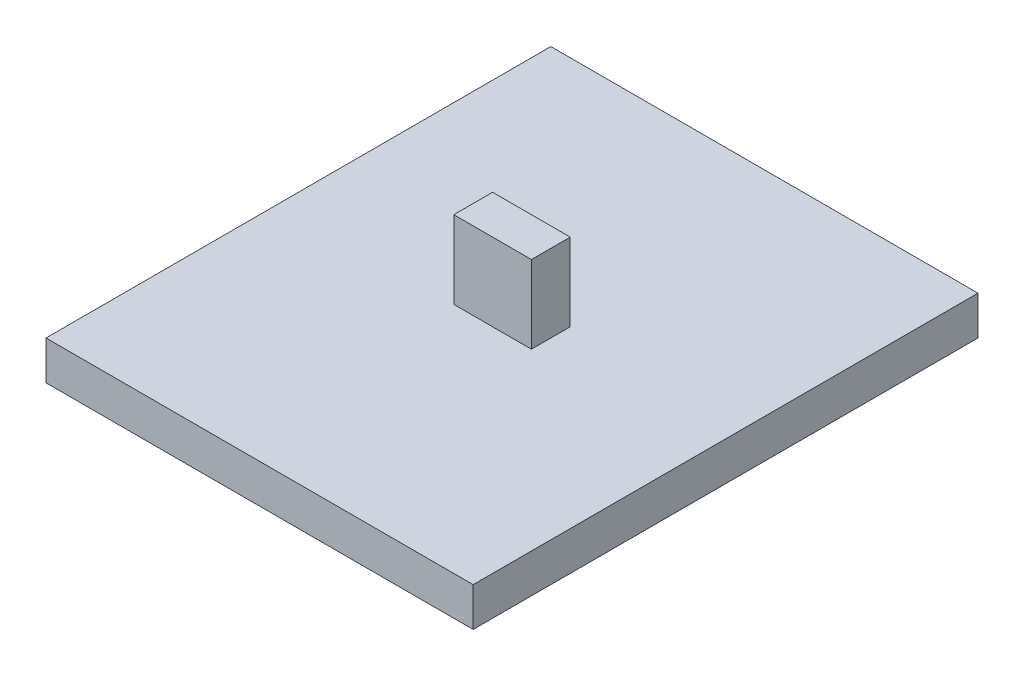
ISO-10303-21;
HEADER;
FILE_DESCRIPTION(('STEP AP214'),'2;1');
FILE_NAME('part.step','',(''),(''),'','','');
FILE_SCHEMA(('AUTOMOTIVE_DESIGN { 1 0 10303 214 1 1 1 1 }'));
ENDSEC;
DATA;
#1=APPLICATION_CONTEXT('core data for automotive mechanical design processes');
#2=APPLICATION_PROTOCOL_DEFINITION('international standard','automotive_design',2000,#1);
#3=PRODUCT_CONTEXT('',#1,'mechanical');
#4=PRODUCT('Part','Part','',(#3));
#5=PRODUCT_RELATED_PRODUCT_CATEGORY('part','',(#4));
#6=PRODUCT_DEFINITION_FORMATION('','',#4);
#7=PRODUCT_DEFINITION_CONTEXT('part definition',#1,'design');
#8=PRODUCT_DEFINITION('design','',#6,#7);
#9=PRODUCT_DEFINITION_SHAPE('','',#8);
#10=(LENGTH_UNIT() NAMED_UNIT(*) SI_UNIT(.MILLI.,.METRE.));
#11=(NAMED_UNIT(*) PLANE_ANGLE_UNIT() SI_UNIT($,.RADIAN.));
#12=(NAMED_UNIT(*) SI_UNIT($,.STERADIAN.) SOLID_ANGLE_UNIT());
#13=UNCERTAINTY_MEASURE_WITH_UNIT(LENGTH_MEASURE(1.E-05),#10,'distance_accuracy_value','');
#14=(GEOMETRIC_REPRESENTATION_CONTEXT(3) GLOBAL_UNCERTAINTY_ASSIGNED_CONTEXT((#13)) GLOBAL_UNIT_ASSIGNED_CONTEXT((#10,
#11,#12)) REPRESENTATION_CONTEXT('',''));
#15=CARTESIAN_POINT('',(0.,0.,0.));
#16=DIRECTION('',(0.,0.,1.));
#17=DIRECTION('',(1.,0.,0.));
#18=AXIS2_PLACEMENT_3D('',#15,#16,#17);
#19=CARTESIAN_POINT('',(-34.925,0.,41.275));
#20=DIRECTION('',(0.,1.,0.));
#21=DIRECTION('',(-1.,0.,0.));
#22=AXIS2_PLACEMENT_3D('',#19,#20,#21);
#23=PLANE('',#22);
#24=DIRECTION('',(1.,0.,0.));
#25=VECTOR('',#24,1.);
#26=CARTESIAN_POINT('',(-34.925,0.,-41.275));
#27=LINE('',#26,#25);
#28=CARTESIAN_POINT('',(-34.925,0.,-41.275));
#29=VERTEX_POINT('',#28);
#30=CARTESIAN_POINT('',(34.925,0.,-41.275));
#31=VERTEX_POINT('',#30);
#32=EDGE_CURVE('E198',#29,#31,#27,.T.);
#33=ORIENTED_EDGE('',*,*,#32,.T.);
#34=DIRECTION('',(0.,0.,-1.));
#35=VECTOR('',#34,1.);
#36=CARTESIAN_POINT('',(34.925,0.,41.275));
#37=LINE('',#36,#35);
#38=CARTESIAN_POINT('',(34.925,0.,41.275));
#39=VERTEX_POINT('',#38);
#40=EDGE_CURVE('E41',#39,#31,#37,.T.);
#41=ORIENTED_EDGE('',*,*,#40,.F.);
#42=DIRECTION('',(1.,0.,0.));
#43=VECTOR('',#42,1.);
#44=CARTESIAN_POINT('',(-34.925,0.,41.275));
#45=LINE('',#44,#43);
#46=CARTESIAN_POINT('',(-34.925,0.,41.275));
#47=VERTEX_POINT('',#46);
#48=EDGE_CURVE('E188',#47,#39,#45,.T.);
#49=ORIENTED_EDGE('',*,*,#48,.F.);
#50=DIRECTION('',(0.,0.,-1.));
#51=VECTOR('',#50,1.);
#52=CARTESIAN_POINT('',(-34.925,0.,41.275));
#53=LINE('',#52,#51);
#54=EDGE_CURVE('E11',#47,#29,#53,.T.);
#55=ORIENTED_EDGE('',*,*,#54,.T.);
#56=EDGE_LOOP('',(#33,#41,#49,#55));
#57=FACE_BOUND('',#56,.T.);
#58=DIRECTION('',(1.,0.,0.));
#59=VECTOR('',#58,1.);
#60=CARTESIAN_POINT('',(-34.925,0.,-38.735));
#61=LINE('',#60,#59);
#62=CARTESIAN_POINT('',(-32.385,0.,-38.735));
#63=VERTEX_POINT('',#62);
#64=CARTESIAN_POINT('',(32.385,0.,-38.735));
#65=VERTEX_POINT('',#64);
#66=EDGE_CURVE('E158',#63,#65,#61,.T.);
#67=ORIENTED_EDGE('',*,*,#66,.F.);
#68=DIRECTION('',(0.,0.,-1.));
#69=VECTOR('',#68,1.);
#70=CARTESIAN_POINT('',(-32.385,0.,41.275));
#71=LINE('',#70,#69);
#72=CARTESIAN_POINT('',(-32.385,0.,38.735));
#73=VERTEX_POINT('',#72);
#74=EDGE_CURVE('E177',#73,#63,#71,.T.);
#75=ORIENTED_EDGE('',*,*,#74,.F.);
#76=DIRECTION('',(1.,0.,0.));
#77=VECTOR('',#76,1.);
#78=CARTESIAN_POINT('',(-34.925,0.,38.735));
#79=LINE('',#78,#77);
#80=CARTESIAN_POINT('',(32.385,0.,38.735));
#81=VERTEX_POINT('',#80);
#82=EDGE_CURVE('E161',#73,#81,#79,.T.);
#83=ORIENTED_EDGE('',*,*,#82,.T.);
#84=DIRECTION('',(0.,0.,-1.));
#85=VECTOR('',#84,1.);
#86=CARTESIAN_POINT('',(32.385,0.,41.275));
#87=LINE('',#86,#85);
#88=EDGE_CURVE('E174',#81,#65,#87,.T.);
#89=ORIENTED_EDGE('',*,*,#88,.T.);
#90=EDGE_LOOP('',(#67,#75,#83,#89));
#91=FACE_BOUND('',#90,.T.);
#92=ADVANCED_FACE('F33',(#57,#91),#23,.F.);
#93=CARTESIAN_POINT('',(-34.925,6.34999999999999,41.275));
#94=DIRECTION('',(1.,0.,0.));
#95=DIRECTION('',(0.,0.,-1.));
#96=AXIS2_PLACEMENT_3D('',#93,#94,#95);
#97=PLANE('',#96);
#98=DIRECTION('',(0.,-1.,0.));
#99=VECTOR('',#98,1.);
#100=CARTESIAN_POINT('',(-34.925,6.34999999999999,-41.275));
#101=LINE('',#100,#99);
#102=CARTESIAN_POINT('',(-34.925,6.34999999999999,-41.275));
#103=VERTEX_POINT('',#102);
#104=EDGE_CURVE('E179',#103,#29,#101,.T.);
#105=ORIENTED_EDGE('',*,*,#104,.T.);
#106=ORIENTED_EDGE('',*,*,#54,.F.);
#107=DIRECTION('',(0.,-1.,0.));
#108=VECTOR('',#107,1.);
#109=CARTESIAN_POINT('',(-34.925,6.34999999999999,41.275));
#110=LINE('',#109,#108);
#111=CARTESIAN_POINT('',(-34.925,6.34999999999999,41.275));
#112=VERTEX_POINT('',#111);
#113=EDGE_CURVE('E185',#112,#47,#110,.T.);
#114=ORIENTED_EDGE('',*,*,#113,.F.);
#115=DIRECTION('',(0.,0.,-1.));
#116=VECTOR('',#115,1.);
#117=CARTESIAN_POINT('',(-34.925,6.34999999999999,41.275));
#118=LINE('',#117,#116);
#119=EDGE_CURVE('E195',#112,#103,#118,.T.);
#120=ORIENTED_EDGE('',*,*,#119,.T.);
#121=EDGE_LOOP('',(#105,#106,#114,#120));
#122=FACE_BOUND('',#121,.T.);
#123=ADVANCED_FACE('F35',(#122),#97,.F.);
#124=CARTESIAN_POINT('',(34.925,0.,41.275));
#125=DIRECTION('',(-1.,0.,0.));
#126=DIRECTION('',(0.,0.,1.));
#127=AXIS2_PLACEMENT_3D('',#124,#125,#126);
#128=PLANE('',#127);
#129=DIRECTION('',(0.,1.,0.));
#130=VECTOR('',#129,1.);
#131=CARTESIAN_POINT('',(34.925,0.,-41.275));
#132=LINE('',#131,#130);
#133=CARTESIAN_POINT('',(34.925,6.35,-41.275));
#134=VERTEX_POINT('',#133);
#135=EDGE_CURVE('E200',#31,#134,#132,.T.);
#136=ORIENTED_EDGE('',*,*,#135,.T.);
#137=DIRECTION('',(0.,0.,-1.));
#138=VECTOR('',#137,1.);
#139=CARTESIAN_POINT('',(34.925,6.35,41.275));
#140=LINE('',#139,#138);
#141=CARTESIAN_POINT('',(34.925,6.35,41.275));
#142=VERTEX_POINT('',#141);
#143=EDGE_CURVE('E205',#142,#134,#140,.T.);
#144=ORIENTED_EDGE('',*,*,#143,.F.);
#145=DIRECTION('',(0.,1.,0.));
#146=VECTOR('',#145,1.);
#147=CARTESIAN_POINT('',(34.925,0.,41.275));
#148=LINE('',#147,#146);
#149=EDGE_CURVE('E191',#39,#142,#148,.T.);
#150=ORIENTED_EDGE('',*,*,#149,.F.);
#151=ORIENTED_EDGE('',*,*,#40,.T.);
#152=EDGE_LOOP('',(#136,#144,#150,#151));
#153=FACE_BOUND('',#152,.T.);
#154=ADVANCED_FACE('F212',(#153),#128,.F.);
#155=CARTESIAN_POINT('',(34.925,6.35,41.275));
#156=DIRECTION('',(0.,-1.,0.));
#157=DIRECTION('',(1.,0.,0.));
#158=AXIS2_PLACEMENT_3D('',#155,#156,#157);
#159=PLANE('',#158);
#160=DIRECTION('',(0.,0.,-1.));
#161=VECTOR('',#160,1.);
#162=CARTESIAN_POINT('',(6.35,6.35,3.175));
#163=LINE('',#162,#161);
#164=CARTESIAN_POINT('',(6.35,6.35,3.175));
#165=VERTEX_POINT('',#164);
#166=CARTESIAN_POINT('',(6.34999999999999,6.35,-3.175));
#167=VERTEX_POINT('',#166);
#168=EDGE_CURVE('E53',#165,#167,#163,.T.);
#169=ORIENTED_EDGE('',*,*,#168,.F.);
#170=DIRECTION('',(1.,0.,0.));
#171=VECTOR('',#170,1.);
#172=CARTESIAN_POINT('',(-6.35,6.35,3.175));
#173=LINE('',#172,#171);
#174=CARTESIAN_POINT('',(-6.35,6.35,3.175));
#175=VERTEX_POINT('',#174);
#176=EDGE_CURVE('E48',#175,#165,#173,.T.);
#177=ORIENTED_EDGE('',*,*,#176,.F.);
#178=DIRECTION('',(0.,0.,-1.));
#179=VECTOR('',#178,1.);
#180=CARTESIAN_POINT('',(-6.35,6.35,3.175));
#181=LINE('',#180,#179);
#182=CARTESIAN_POINT('',(-6.35,6.35,-3.175));
#183=VERTEX_POINT('',#182);
#184=EDGE_CURVE('E153',#175,#183,#181,.T.);
#185=ORIENTED_EDGE('',*,*,#184,.T.);
#186=DIRECTION('',(1.,0.,0.));
#187=VECTOR('',#186,1.);
#188=CARTESIAN_POINT('',(-6.35,6.35,-3.175));
#189=LINE('',#188,#187);
#190=EDGE_CURVE('E146',#183,#167,#189,.T.);
#191=ORIENTED_EDGE('',*,*,#190,.T.);
#192=EDGE_LOOP('',(#169,#177,#185,#191));
#193=FACE_BOUND('',#192,.T.);
#194=DIRECTION('',(-1.,0.,0.));
#195=VECTOR('',#194,1.);
#196=CARTESIAN_POINT('',(34.925,6.35,-41.275));
#197=LINE('',#196,#195);
#198=EDGE_CURVE('E189',#134,#103,#197,.T.);
#199=ORIENTED_EDGE('',*,*,#198,.T.);
#200=ORIENTED_EDGE('',*,*,#119,.F.);
#201=DIRECTION('',(-1.,0.,0.));
#202=VECTOR('',#201,1.);
#203=CARTESIAN_POINT('',(34.925,6.35,41.275));
#204=LINE('',#203,#202);
#205=EDGE_CURVE('E193',#142,#112,#204,.T.);
#206=ORIENTED_EDGE('',*,*,#205,.F.);
#207=ORIENTED_EDGE('',*,*,#143,.T.);
#208=EDGE_LOOP('',(#199,#200,#206,#207));
#209=FACE_BOUND('',#208,.T.);
#210=ADVANCED_FACE('F221',(#193,#209),#159,.F.);
#211=CARTESIAN_POINT('',(0.,0.,41.275));
#212=DIRECTION('',(0.,0.,1.));
#213=DIRECTION('',(1.,0.,0.));
#214=AXIS2_PLACEMENT_3D('',#211,#212,#213);
#215=PLANE('',#214);
#216=ORIENTED_EDGE('',*,*,#113,.T.);
#217=ORIENTED_EDGE('',*,*,#48,.T.);
#218=ORIENTED_EDGE('',*,*,#149,.T.);
#219=ORIENTED_EDGE('',*,*,#205,.T.);
#220=EDGE_LOOP('',(#216,#217,#218,#219));
#221=FACE_BOUND('',#220,.T.);
#222=ADVANCED_FACE('F227',(#221),#215,.T.);
#223=CARTESIAN_POINT('',(0.,0.,-41.275));
#224=DIRECTION('',(0.,0.,1.));
#225=DIRECTION('',(1.,0.,0.));
#226=AXIS2_PLACEMENT_3D('',#223,#224,#225);
#227=PLANE('',#226);
#228=ORIENTED_EDGE('',*,*,#104,.F.);
#229=ORIENTED_EDGE('',*,*,#198,.F.);
#230=ORIENTED_EDGE('',*,*,#135,.F.);
#231=ORIENTED_EDGE('',*,*,#32,.F.);
#232=EDGE_LOOP('',(#228,#229,#230,#231));
#233=FACE_BOUND('',#232,.T.);
#234=ADVANCED_FACE('F218',(#233),#227,.F.);
#235=CARTESIAN_POINT('',(-32.385,6.34999999999999,41.275));
#236=DIRECTION('',(1.,0.,0.));
#237=DIRECTION('',(0.,0.,-1.));
#238=AXIS2_PLACEMENT_3D('',#235,#236,#237);
#239=PLANE('',#238);
#240=DIRECTION('',(0.,-1.,0.));
#241=VECTOR('',#240,1.);
#242=CARTESIAN_POINT('',(-32.385,6.34999999999999,-38.735));
#243=LINE('',#242,#241);
#244=CARTESIAN_POINT('',(-32.385,3.80999999999999,-38.735));
#245=VERTEX_POINT('',#244);
#246=EDGE_CURVE('E155',#245,#63,#243,.T.);
#247=ORIENTED_EDGE('',*,*,#246,.F.);
#248=DIRECTION('',(0.,0.,-1.));
#249=VECTOR('',#248,1.);
#250=CARTESIAN_POINT('',(-32.385,3.80999999999999,41.275));
#251=LINE('',#250,#249);
#252=CARTESIAN_POINT('',(-32.385,3.80999999999999,38.735));
#253=VERTEX_POINT('',#252);
#254=EDGE_CURVE('E163',#253,#245,#251,.T.);
#255=ORIENTED_EDGE('',*,*,#254,.F.);
#256=DIRECTION('',(0.,-1.,0.));
#257=VECTOR('',#256,1.);
#258=CARTESIAN_POINT('',(-32.385,6.34999999999999,38.735));
#259=LINE('',#258,#257);
#260=EDGE_CURVE('E159',#253,#73,#259,.T.);
#261=ORIENTED_EDGE('',*,*,#260,.T.);
#262=ORIENTED_EDGE('',*,*,#74,.T.);
#263=EDGE_LOOP('',(#247,#255,#261,#262));
#264=FACE_BOUND('',#263,.T.);
#265=ADVANCED_FACE('F247',(#264),#239,.T.);
#266=CARTESIAN_POINT('',(32.385,0.,41.275));
#267=DIRECTION('',(-1.,0.,0.));
#268=DIRECTION('',(0.,0.,1.));
#269=AXIS2_PLACEMENT_3D('',#266,#267,#268);
#270=PLANE('',#269);
#271=DIRECTION('',(0.,1.,0.));
#272=VECTOR('',#271,1.);
#273=CARTESIAN_POINT('',(32.385,0.,-38.735));
#274=LINE('',#273,#272);
#275=CARTESIAN_POINT('',(32.385,3.81,-38.735));
#276=VERTEX_POINT('',#275);
#277=EDGE_CURVE('E169',#65,#276,#274,.T.);
#278=ORIENTED_EDGE('',*,*,#277,.F.);
#279=ORIENTED_EDGE('',*,*,#88,.F.);
#280=DIRECTION('',(0.,1.,0.));
#281=VECTOR('',#280,1.);
#282=CARTESIAN_POINT('',(32.385,0.,38.735));
#283=LINE('',#282,#281);
#284=CARTESIAN_POINT('',(32.385,3.81,38.735));
#285=VERTEX_POINT('',#284);
#286=EDGE_CURVE('E171',#81,#285,#283,.T.);
#287=ORIENTED_EDGE('',*,*,#286,.T.);
#288=DIRECTION('',(0.,0.,-1.));
#289=VECTOR('',#288,1.);
#290=CARTESIAN_POINT('',(32.385,3.81,41.275));
#291=LINE('',#290,#289);
#292=EDGE_CURVE('E166',#285,#276,#291,.T.);
#293=ORIENTED_EDGE('',*,*,#292,.T.);
#294=EDGE_LOOP('',(#278,#279,#287,#293));
#295=FACE_BOUND('',#294,.T.);
#296=ADVANCED_FACE('F237',(#295),#270,.T.);
#297=CARTESIAN_POINT('',(34.925,3.81,41.275));
#298=DIRECTION('',(0.,-1.,0.));
#299=DIRECTION('',(1.,0.,0.));
#300=AXIS2_PLACEMENT_3D('',#297,#298,#299);
#301=PLANE('',#300);
#302=DIRECTION('',(-1.,0.,0.));
#303=VECTOR('',#302,1.);
#304=CARTESIAN_POINT('',(34.925,3.81,-38.735));
#305=LINE('',#304,#303);
#306=EDGE_CURVE('E162',#276,#245,#305,.T.);
#307=ORIENTED_EDGE('',*,*,#306,.F.);
#308=ORIENTED_EDGE('',*,*,#292,.F.);
#309=DIRECTION('',(-1.,0.,0.));
#310=VECTOR('',#309,1.);
#311=CARTESIAN_POINT('',(34.925,3.81,38.735));
#312=LINE('',#311,#310);
#313=EDGE_CURVE('E167',#285,#253,#312,.T.);
#314=ORIENTED_EDGE('',*,*,#313,.T.);
#315=ORIENTED_EDGE('',*,*,#254,.T.);
#316=EDGE_LOOP('',(#307,#308,#314,#315));
#317=FACE_BOUND('',#316,.T.);
#318=ADVANCED_FACE('F243',(#317),#301,.T.);
#319=CARTESIAN_POINT('',(0.,0.,38.735));
#320=DIRECTION('',(0.,0.,1.));
#321=DIRECTION('',(1.,0.,0.));
#322=AXIS2_PLACEMENT_3D('',#319,#320,#321);
#323=PLANE('',#322);
#324=ORIENTED_EDGE('',*,*,#260,.F.);
#325=ORIENTED_EDGE('',*,*,#313,.F.);
#326=ORIENTED_EDGE('',*,*,#286,.F.);
#327=ORIENTED_EDGE('',*,*,#82,.F.);
#328=EDGE_LOOP('',(#324,#325,#326,#327));
#329=FACE_BOUND('',#328,.T.);
#330=ADVANCED_FACE('F250',(#329),#323,.F.);
#331=CARTESIAN_POINT('',(0.,0.,-38.735));
#332=DIRECTION('',(0.,0.,1.));
#333=DIRECTION('',(1.,0.,0.));
#334=AXIS2_PLACEMENT_3D('',#331,#332,#333);
#335=PLANE('',#334);
#336=ORIENTED_EDGE('',*,*,#246,.T.);
#337=ORIENTED_EDGE('',*,*,#66,.T.);
#338=ORIENTED_EDGE('',*,*,#277,.T.);
#339=ORIENTED_EDGE('',*,*,#306,.T.);
#340=EDGE_LOOP('',(#336,#337,#338,#339));
#341=FACE_BOUND('',#340,.T.);
#342=ADVANCED_FACE('F234',(#341),#335,.T.);
#343=CARTESIAN_POINT('',(-6.35,19.05,3.175));
#344=DIRECTION('',(1.,0.,0.));
#345=DIRECTION('',(0.,0.,-1.));
#346=AXIS2_PLACEMENT_3D('',#343,#344,#345);
#347=PLANE('',#346);
#348=DIRECTION('',(0.,-1.,0.));
#349=VECTOR('',#348,1.);
#350=CARTESIAN_POINT('',(-6.35,19.05,-3.175));
#351=LINE('',#350,#349);
#352=CARTESIAN_POINT('',(-6.35,19.05,-3.175));
#353=VERTEX_POINT('',#352);
#354=EDGE_CURVE('E143',#353,#183,#351,.T.);
#355=ORIENTED_EDGE('',*,*,#354,.T.);
#356=ORIENTED_EDGE('',*,*,#184,.F.);
#357=DIRECTION('',(0.,-1.,0.));
#358=VECTOR('',#357,1.);
#359=CARTESIAN_POINT('',(-6.35,19.05,3.175));
#360=LINE('',#359,#358);
#361=CARTESIAN_POINT('',(-6.35,19.05,3.175));
#362=VERTEX_POINT('',#361);
#363=EDGE_CURVE('E150',#362,#175,#360,.T.);
#364=ORIENTED_EDGE('',*,*,#363,.F.);
#365=DIRECTION('',(0.,0.,-1.));
#366=VECTOR('',#365,1.);
#367=CARTESIAN_POINT('',(-6.35,19.05,3.175));
#368=LINE('',#367,#366);
#369=EDGE_CURVE('E134',#362,#353,#368,.T.);
#370=ORIENTED_EDGE('',*,*,#369,.T.);
#371=EDGE_LOOP('',(#355,#356,#364,#370));
#372=FACE_BOUND('',#371,.T.);
#373=ADVANCED_FACE('F257',(#372),#347,.F.);
#374=CARTESIAN_POINT('',(6.35,6.35,3.175));
#375=DIRECTION('',(-1.,0.,0.));
#376=DIRECTION('',(0.,0.,1.));
#377=AXIS2_PLACEMENT_3D('',#374,#375,#376);
#378=PLANE('',#377);
#379=DIRECTION('',(0.,1.,0.));
#380=VECTOR('',#379,1.);
#381=CARTESIAN_POINT('',(6.35,6.35,-3.175));
#382=LINE('',#381,#380);
#383=CARTESIAN_POINT('',(6.35,19.05,-3.175));
#384=VERTEX_POINT('',#383);
#385=EDGE_CURVE('E131',#167,#384,#382,.T.);
#386=ORIENTED_EDGE('',*,*,#385,.T.);
#387=DIRECTION('',(0.,0.,-1.));
#388=VECTOR('',#387,1.);
#389=CARTESIAN_POINT('',(6.35,19.05,3.175));
#390=LINE('',#389,#388);
#391=CARTESIAN_POINT('',(6.35,19.05,3.175));
#392=VERTEX_POINT('',#391);
#393=EDGE_CURVE('E128',#392,#384,#390,.T.);
#394=ORIENTED_EDGE('',*,*,#393,.F.);
#395=DIRECTION('',(0.,1.,0.));
#396=VECTOR('',#395,1.);
#397=CARTESIAN_POINT('',(6.35,6.35,3.175));
#398=LINE('',#397,#396);
#399=EDGE_CURVE('E119',#165,#392,#398,.T.);
#400=ORIENTED_EDGE('',*,*,#399,.F.);
#401=ORIENTED_EDGE('',*,*,#168,.T.);
#402=EDGE_LOOP('',(#386,#394,#400,#401));
#403=FACE_BOUND('',#402,.T.);
#404=ADVANCED_FACE('F129',(#403),#378,.F.);
#405=CARTESIAN_POINT('',(6.35,19.05,3.175));
#406=DIRECTION('',(0.,-1.,0.));
#407=DIRECTION('',(1.,0.,0.));
#408=AXIS2_PLACEMENT_3D('',#405,#406,#407);
#409=PLANE('',#408);
#410=DIRECTION('',(-1.,0.,0.));
#411=VECTOR('',#410,1.);
#412=CARTESIAN_POINT('',(6.35,19.05,-3.175));
#413=LINE('',#412,#411);
#414=EDGE_CURVE('E149',#384,#353,#413,.T.);
#415=ORIENTED_EDGE('',*,*,#414,.T.);
#416=ORIENTED_EDGE('',*,*,#369,.F.);
#417=DIRECTION('',(-1.,0.,0.));
#418=VECTOR('',#417,1.);
#419=CARTESIAN_POINT('',(6.35,19.05,3.175));
#420=LINE('',#419,#418);
#421=EDGE_CURVE('E123',#392,#362,#420,.T.);
#422=ORIENTED_EDGE('',*,*,#421,.F.);
#423=ORIENTED_EDGE('',*,*,#393,.T.);
#424=EDGE_LOOP('',(#415,#416,#422,#423));
#425=FACE_BOUND('',#424,.T.);
#426=ADVANCED_FACE('F136',(#425),#409,.F.);
#427=CARTESIAN_POINT('',(0.,0.,3.175));
#428=DIRECTION('',(0.,0.,1.));
#429=DIRECTION('',(1.,0.,0.));
#430=AXIS2_PLACEMENT_3D('',#427,#428,#429);
#431=PLANE('',#430);
#432=ORIENTED_EDGE('',*,*,#363,.T.);
#433=ORIENTED_EDGE('',*,*,#176,.T.);
#434=ORIENTED_EDGE('',*,*,#399,.T.);
#435=ORIENTED_EDGE('',*,*,#421,.T.);
#436=EDGE_LOOP('',(#432,#433,#434,#435));
#437=FACE_BOUND('',#436,.T.);
#438=ADVANCED_FACE('F121',(#437),#431,.T.);
#439=CARTESIAN_POINT('',(0.,0.,-3.175));
#440=DIRECTION('',(0.,0.,1.));
#441=DIRECTION('',(1.,0.,0.));
#442=AXIS2_PLACEMENT_3D('',#439,#440,#441);
#443=PLANE('',#442);
#444=ORIENTED_EDGE('',*,*,#354,.F.);
#445=ORIENTED_EDGE('',*,*,#414,.F.);
#446=ORIENTED_EDGE('',*,*,#385,.F.);
#447=ORIENTED_EDGE('',*,*,#190,.F.);
#448=EDGE_LOOP('',(#444,#445,#446,#447));
#449=FACE_BOUND('',#448,.T.);
#450=ADVANCED_FACE('F355',(#449),#443,.F.);
#451=CLOSED_SHELL('',(#92,#123,#154,#210,#222,#234,#265,#296,#318,#330,#342,#373,#404,#426,#438,#450));
#452=MANIFOLD_SOLID_BREP('B2',#451);
#453=ADVANCED_BREP_SHAPE_REPRESENTATION('',(#18,#452),#14);
#454=SHAPE_DEFINITION_REPRESENTATION(#9,#453);
ENDSEC;
END-ISO-10303-21;
